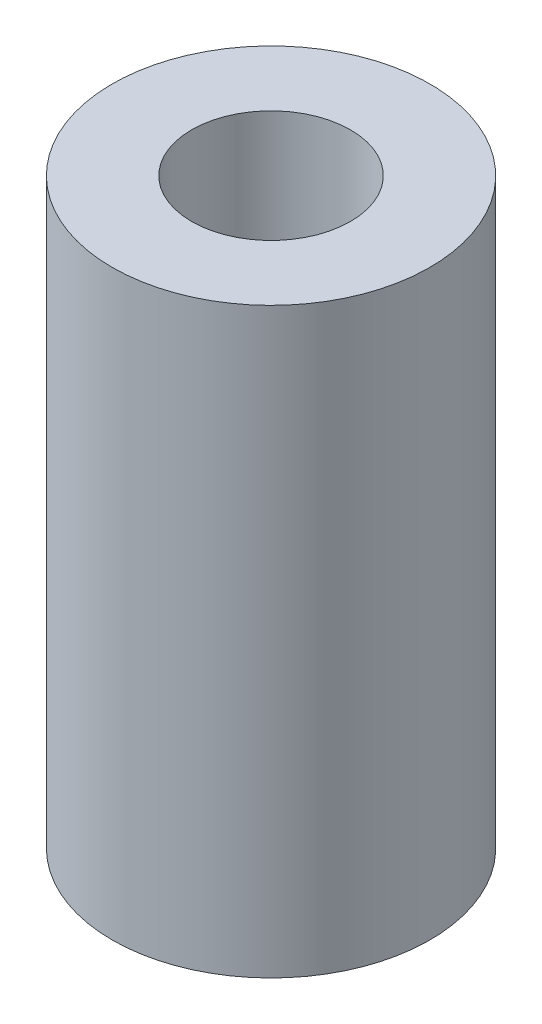
ISO-10303-21;
HEADER;
FILE_DESCRIPTION(('STEP AP214'),'2;1');
FILE_NAME('part.step','',(''),(''),'','','');
FILE_SCHEMA(('AUTOMOTIVE_DESIGN { 1 0 10303 214 1 1 1 1 }'));
ENDSEC;
DATA;
#1=APPLICATION_CONTEXT('core data for automotive mechanical design processes');
#2=APPLICATION_PROTOCOL_DEFINITION('international standard','automotive_design',2000,#1);
#3=PRODUCT_CONTEXT('',#1,'mechanical');
#4=PRODUCT('Part','Part','',(#3));
#5=PRODUCT_RELATED_PRODUCT_CATEGORY('part','',(#4));
#6=PRODUCT_DEFINITION_FORMATION('','',#4);
#7=PRODUCT_DEFINITION_CONTEXT('part definition',#1,'design');
#8=PRODUCT_DEFINITION('design','',#6,#7);
#9=PRODUCT_DEFINITION_SHAPE('','',#8);
#10=(LENGTH_UNIT() NAMED_UNIT(*) SI_UNIT(.MILLI.,.METRE.));
#11=(NAMED_UNIT(*) PLANE_ANGLE_UNIT() SI_UNIT($,.RADIAN.));
#12=(NAMED_UNIT(*) SI_UNIT($,.STERADIAN.) SOLID_ANGLE_UNIT());
#13=UNCERTAINTY_MEASURE_WITH_UNIT(LENGTH_MEASURE(1.E-05),#10,'distance_accuracy_value','');
#14=(GEOMETRIC_REPRESENTATION_CONTEXT(3) GLOBAL_UNCERTAINTY_ASSIGNED_CONTEXT((#13)) GLOBAL_UNIT_ASSIGNED_CONTEXT((#10,
#11,#12)) REPRESENTATION_CONTEXT('',''));
#15=CARTESIAN_POINT('',(0.,0.,0.));
#16=DIRECTION('',(0.,0.,1.));
#17=DIRECTION('',(1.,0.,0.));
#18=AXIS2_PLACEMENT_3D('',#15,#16,#17);
#19=CARTESIAN_POINT('',(0.,11.,0.));
#20=DIRECTION('',(0.,1.,0.));
#21=DIRECTION('',(0.,0.,1.));
#22=AXIS2_PLACEMENT_3D('',#19,#20,#21);
#23=PLANE('',#22);
#24=CARTESIAN_POINT('',(0.,11.,0.));
#25=DIRECTION('',(0.,1.,0.));
#26=DIRECTION('',(0.,0.,1.));
#27=AXIS2_PLACEMENT_3D('',#24,#25,#26);
#28=CIRCLE('',#27,3.);
#29=CARTESIAN_POINT('',(0.,11.,3.));
#30=VERTEX_POINT('',#29);
#31=EDGE_CURVE('E10',#30,#30,#28,.T.);
#32=ORIENTED_EDGE('',*,*,#31,.T.);
#33=EDGE_LOOP('',(#32));
#34=FACE_BOUND('',#33,.T.);
#35=CARTESIAN_POINT('',(0.,11.,0.));
#36=DIRECTION('',(0.,1.,0.));
#37=DIRECTION('',(0.,0.,1.));
#38=AXIS2_PLACEMENT_3D('',#35,#36,#37);
#39=CIRCLE('',#38,1.5);
#40=CARTESIAN_POINT('',(0.,11.,1.5));
#41=VERTEX_POINT('',#40);
#42=EDGE_CURVE('E41',#41,#41,#39,.T.);
#43=ORIENTED_EDGE('',*,*,#42,.F.);
#44=EDGE_LOOP('',(#43));
#45=FACE_BOUND('',#44,.T.);
#46=ADVANCED_FACE('F30',(#34,#45),#23,.T.);
#47=CARTESIAN_POINT('',(0.,0.,0.));
#48=DIRECTION('',(0.,1.,0.));
#49=DIRECTION('',(0.,0.,1.));
#50=AXIS2_PLACEMENT_3D('',#47,#48,#49);
#51=PLANE('',#50);
#52=CARTESIAN_POINT('',(0.,0.,0.));
#53=DIRECTION('',(0.,1.,0.));
#54=DIRECTION('',(0.,0.,1.));
#55=AXIS2_PLACEMENT_3D('',#52,#53,#54);
#56=CIRCLE('',#55,3.);
#57=CARTESIAN_POINT('',(0.,0.,3.));
#58=VERTEX_POINT('',#57);
#59=EDGE_CURVE('E34',#58,#58,#56,.T.);
#60=ORIENTED_EDGE('',*,*,#59,.F.);
#61=EDGE_LOOP('',(#60));
#62=FACE_BOUND('',#61,.T.);
#63=CARTESIAN_POINT('',(0.,0.,0.));
#64=DIRECTION('',(0.,1.,0.));
#65=DIRECTION('',(0.,0.,1.));
#66=AXIS2_PLACEMENT_3D('',#63,#64,#65);
#67=CIRCLE('',#66,1.5);
#68=CARTESIAN_POINT('',(0.,0.,1.5));
#69=VERTEX_POINT('',#68);
#70=EDGE_CURVE('E43',#69,#69,#67,.T.);
#71=ORIENTED_EDGE('',*,*,#70,.T.);
#72=EDGE_LOOP('',(#71));
#73=FACE_BOUND('',#72,.T.);
#74=ADVANCED_FACE('F53',(#62,#73),#51,.F.);
#75=CARTESIAN_POINT('',(0.,11.,0.));
#76=DIRECTION('',(0.,-1.,0.));
#77=DIRECTION('',(0.,0.,-1.));
#78=AXIS2_PLACEMENT_3D('',#75,#76,#77);
#79=CYLINDRICAL_SURFACE('',#78,3.);
#80=ORIENTED_EDGE('',*,*,#31,.F.);
#81=EDGE_LOOP('',(#80));
#82=FACE_BOUND('',#81,.T.);
#83=ORIENTED_EDGE('',*,*,#59,.T.);
#84=EDGE_LOOP('',(#83));
#85=FACE_BOUND('',#84,.T.);
#86=ADVANCED_FACE('F32',(#82,#85),#79,.T.);
#87=CARTESIAN_POINT('',(0.,11.,0.));
#88=DIRECTION('',(0.,-1.,0.));
#89=DIRECTION('',(0.,0.,-1.));
#90=AXIS2_PLACEMENT_3D('',#87,#88,#89);
#91=CYLINDRICAL_SURFACE('',#90,1.5);
#92=ORIENTED_EDGE('',*,*,#42,.T.);
#93=EDGE_LOOP('',(#92));
#94=FACE_BOUND('',#93,.T.);
#95=ORIENTED_EDGE('',*,*,#70,.F.);
#96=EDGE_LOOP('',(#95));
#97=FACE_BOUND('',#96,.T.);
#98=ADVANCED_FACE('F49',(#94,#97),#91,.F.);
#99=CLOSED_SHELL('',(#46,#74,#86,#98));
#100=MANIFOLD_SOLID_BREP('B2',#99);
#101=ADVANCED_BREP_SHAPE_REPRESENTATION('',(#18,#100),#14);
#102=SHAPE_DEFINITION_REPRESENTATION(#9,#101);
ENDSEC;
END-ISO-10303-21;
